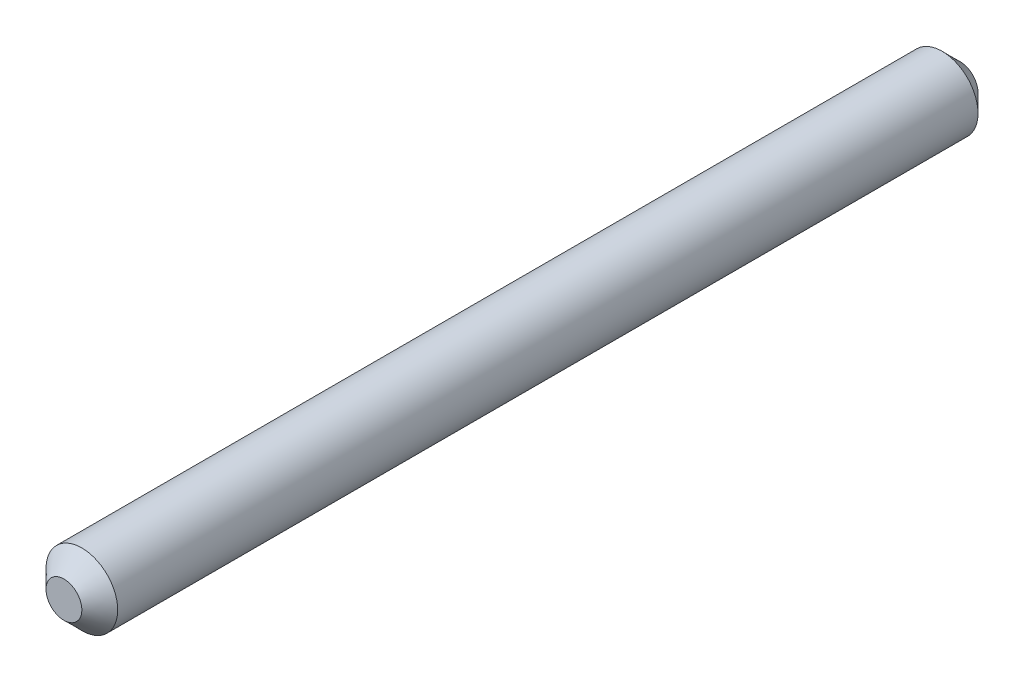
ISO-10303-21;
HEADER;
FILE_DESCRIPTION(('STEP AP214'),'2;1');
FILE_NAME('part.step','',(''),(''),'','','');
FILE_SCHEMA(('AUTOMOTIVE_DESIGN { 1 0 10303 214 1 1 1 1 }'));
ENDSEC;
DATA;
#1=APPLICATION_CONTEXT('core data for automotive mechanical design processes');
#2=APPLICATION_PROTOCOL_DEFINITION('international standard','automotive_design',2000,#1);
#3=PRODUCT_CONTEXT('',#1,'mechanical');
#4=PRODUCT('Part','Part','',(#3));
#5=PRODUCT_RELATED_PRODUCT_CATEGORY('part','',(#4));
#6=PRODUCT_DEFINITION_FORMATION('','',#4);
#7=PRODUCT_DEFINITION_CONTEXT('part definition',#1,'design');
#8=PRODUCT_DEFINITION('design','',#6,#7);
#9=PRODUCT_DEFINITION_SHAPE('','',#8);
#10=(LENGTH_UNIT() NAMED_UNIT(*) SI_UNIT(.MILLI.,.METRE.));
#11=(NAMED_UNIT(*) PLANE_ANGLE_UNIT() SI_UNIT($,.RADIAN.));
#12=(NAMED_UNIT(*) SI_UNIT($,.STERADIAN.) SOLID_ANGLE_UNIT());
#13=UNCERTAINTY_MEASURE_WITH_UNIT(LENGTH_MEASURE(1.E-05),#10,'distance_accuracy_value','');
#14=(GEOMETRIC_REPRESENTATION_CONTEXT(3) GLOBAL_UNCERTAINTY_ASSIGNED_CONTEXT((#13)) GLOBAL_UNIT_ASSIGNED_CONTEXT((#10,
#11,#12)) REPRESENTATION_CONTEXT('',''));
#15=CARTESIAN_POINT('',(0.,0.,0.));
#16=DIRECTION('',(0.,0.,1.));
#17=DIRECTION('',(1.,0.,0.));
#18=AXIS2_PLACEMENT_3D('',#15,#16,#17);
#19=CARTESIAN_POINT('',(0.,0.,-25.));
#20=DIRECTION('',(0.,0.,1.));
#21=DIRECTION('',(-1.,0.,0.));
#22=AXIS2_PLACEMENT_3D('',#19,#20,#21);
#23=CYLINDRICAL_SURFACE('',#22,1.);
#24=CARTESIAN_POINT('',(0.,0.,-0.500000000000004));
#25=DIRECTION('',(0.,0.,1.));
#26=DIRECTION('',(1.,0.,0.));
#27=AXIS2_PLACEMENT_3D('',#24,#25,#26);
#28=CIRCLE('',#27,1.);
#29=CARTESIAN_POINT('',(1.,0.,-0.500000000000004));
#30=VERTEX_POINT('',#29);
#31=EDGE_CURVE('E46',#30,#30,#28,.T.);
#32=ORIENTED_EDGE('',*,*,#31,.F.);
#33=EDGE_LOOP('',(#32));
#34=FACE_BOUND('',#33,.T.);
#35=CARTESIAN_POINT('',(0.,0.,-24.5));
#36=DIRECTION('',(0.,0.,1.));
#37=DIRECTION('',(1.,0.,0.));
#38=AXIS2_PLACEMENT_3D('',#35,#36,#37);
#39=CIRCLE('',#38,1.);
#40=CARTESIAN_POINT('',(1.,0.,-24.5));
#41=VERTEX_POINT('',#40);
#42=EDGE_CURVE('E50',#41,#41,#39,.F.);
#43=ORIENTED_EDGE('',*,*,#42,.F.);
#44=EDGE_LOOP('',(#43));
#45=FACE_BOUND('',#44,.T.);
#46=ADVANCED_FACE('F35',(#34,#45),#23,.T.);
#47=CARTESIAN_POINT('',(0.,0.,-25.));
#48=DIRECTION('',(0.,0.,-1.));
#49=DIRECTION('',(1.,0.,0.));
#50=AXIS2_PLACEMENT_3D('',#47,#48,#49);
#51=PLANE('',#50);
#52=CARTESIAN_POINT('',(0.,0.,-25.));
#53=DIRECTION('',(0.,0.,1.));
#54=DIRECTION('',(1.,0.,0.));
#55=AXIS2_PLACEMENT_3D('',#52,#53,#54);
#56=CIRCLE('',#55,0.499999999999997);
#57=CARTESIAN_POINT('',(0.499999999999997,0.,-25.));
#58=VERTEX_POINT('',#57);
#59=EDGE_CURVE('E10',#58,#58,#56,.T.);
#60=ORIENTED_EDGE('',*,*,#59,.F.);
#61=EDGE_LOOP('',(#60));
#62=FACE_BOUND('',#61,.T.);
#63=ADVANCED_FACE('F58',(#62),#51,.T.);
#64=CARTESIAN_POINT('',(0.,0.,0.));
#65=DIRECTION('',(0.,0.,-1.));
#66=DIRECTION('',(1.,0.,0.));
#67=AXIS2_PLACEMENT_3D('',#64,#65,#66);
#68=PLANE('',#67);
#69=CARTESIAN_POINT('',(0.,0.,0.));
#70=DIRECTION('',(0.,0.,1.));
#71=DIRECTION('',(1.,0.,0.));
#72=AXIS2_PLACEMENT_3D('',#69,#70,#71);
#73=CIRCLE('',#72,0.499999999999994);
#74=CARTESIAN_POINT('',(0.499999999999994,0.,0.));
#75=VERTEX_POINT('',#74);
#76=EDGE_CURVE('E42',#75,#75,#73,.F.);
#77=ORIENTED_EDGE('',*,*,#76,.F.);
#78=EDGE_LOOP('',(#77));
#79=FACE_BOUND('',#78,.T.);
#80=ADVANCED_FACE('F64',(#79),#68,.F.);
#81=CARTESIAN_POINT('',(0.,0.,-0.500000000000004));
#82=DIRECTION('',(0.,0.,-1.));
#83=DIRECTION('',(1.,0.,0.));
#84=AXIS2_PLACEMENT_3D('',#81,#82,#83);
#85=CONICAL_SURFACE('',#84,1.,0.785398163397451);
#86=ORIENTED_EDGE('',*,*,#76,.T.);
#87=EDGE_LOOP('',(#86));
#88=FACE_BOUND('',#87,.T.);
#89=ORIENTED_EDGE('',*,*,#31,.T.);
#90=EDGE_LOOP('',(#89));
#91=FACE_BOUND('',#90,.T.);
#92=ADVANCED_FACE('F69',(#88,#91),#85,.T.);
#93=CARTESIAN_POINT('',(0.,0.,-25.));
#94=DIRECTION('',(0.,0.,1.));
#95=DIRECTION('',(-1.,0.,0.));
#96=AXIS2_PLACEMENT_3D('',#93,#94,#95);
#97=CONICAL_SURFACE('',#96,0.499999999999997,0.785398163397447);
#98=ORIENTED_EDGE('',*,*,#42,.T.);
#99=EDGE_LOOP('',(#98));
#100=FACE_BOUND('',#99,.T.);
#101=ORIENTED_EDGE('',*,*,#59,.T.);
#102=EDGE_LOOP('',(#101));
#103=FACE_BOUND('',#102,.T.);
#104=ADVANCED_FACE('F37',(#100,#103),#97,.T.);
#105=CLOSED_SHELL('',(#46,#63,#80,#92,#104));
#106=MANIFOLD_SOLID_BREP('B2',#105);
#107=ADVANCED_BREP_SHAPE_REPRESENTATION('',(#18,#106),#14);
#108=SHAPE_DEFINITION_REPRESENTATION(#9,#107);
ENDSEC;
END-ISO-10303-21;
